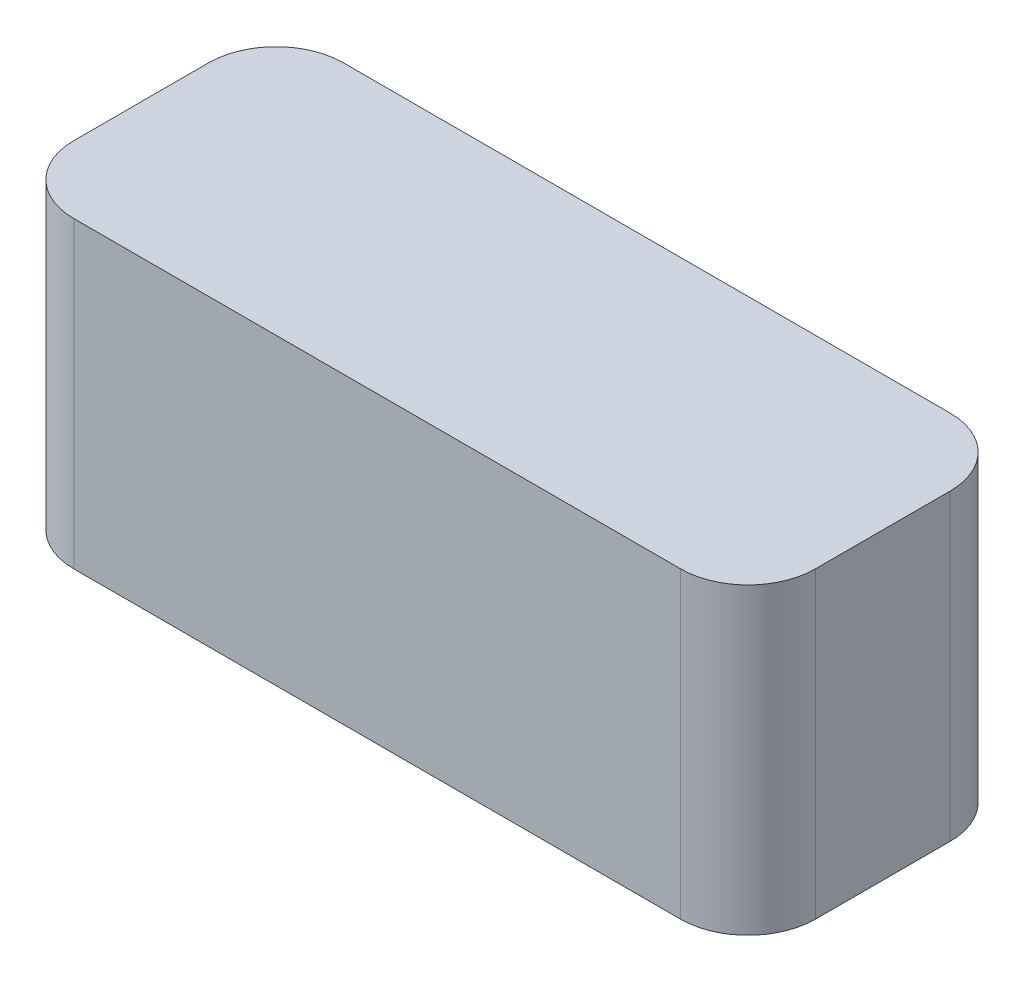
ISO-10303-21;
HEADER;
FILE_DESCRIPTION(('STEP AP214'),'2;1');
FILE_NAME('part.step','',(''),(''),'','','');
FILE_SCHEMA(('AUTOMOTIVE_DESIGN { 1 0 10303 214 1 1 1 1 }'));
ENDSEC;
DATA;
#1=APPLICATION_CONTEXT('core data for automotive mechanical design processes');
#2=APPLICATION_PROTOCOL_DEFINITION('international standard','automotive_design',2000,#1);
#3=PRODUCT_CONTEXT('',#1,'mechanical');
#4=PRODUCT('Part','Part','',(#3));
#5=PRODUCT_RELATED_PRODUCT_CATEGORY('part','',(#4));
#6=PRODUCT_DEFINITION_FORMATION('','',#4);
#7=PRODUCT_DEFINITION_CONTEXT('part definition',#1,'design');
#8=PRODUCT_DEFINITION('design','',#6,#7);
#9=PRODUCT_DEFINITION_SHAPE('','',#8);
#10=(LENGTH_UNIT() NAMED_UNIT(*) SI_UNIT(.MILLI.,.METRE.));
#11=(NAMED_UNIT(*) PLANE_ANGLE_UNIT() SI_UNIT($,.RADIAN.));
#12=(NAMED_UNIT(*) SI_UNIT($,.STERADIAN.) SOLID_ANGLE_UNIT());
#13=UNCERTAINTY_MEASURE_WITH_UNIT(LENGTH_MEASURE(1.E-05),#10,'distance_accuracy_value','');
#14=(GEOMETRIC_REPRESENTATION_CONTEXT(3) GLOBAL_UNCERTAINTY_ASSIGNED_CONTEXT((#13)) GLOBAL_UNIT_ASSIGNED_CONTEXT((#10,
#11,#12)) REPRESENTATION_CONTEXT('',''));
#15=CARTESIAN_POINT('',(0.,0.,0.));
#16=DIRECTION('',(0.,0.,1.));
#17=DIRECTION('',(1.,0.,0.));
#18=AXIS2_PLACEMENT_3D('',#15,#16,#17);
#19=CARTESIAN_POINT('',(0.,0.,40.));
#20=DIRECTION('',(1.,0.,0.));
#21=DIRECTION('',(0.,0.,-1.));
#22=AXIS2_PLACEMENT_3D('',#19,#20,#21);
#23=PLANE('',#22);
#24=DIRECTION('',(0.,0.,-1.));
#25=VECTOR('',#24,1.);
#26=CARTESIAN_POINT('',(0.,45.,40.));
#27=LINE('',#26,#25);
#28=CARTESIAN_POINT('',(0.,45.,30.));
#29=VERTEX_POINT('',#28);
#30=CARTESIAN_POINT('',(0.,45.,10.));
#31=VERTEX_POINT('',#30);
#32=EDGE_CURVE('E122',#29,#31,#27,.T.);
#33=ORIENTED_EDGE('',*,*,#32,.T.);
#34=DIRECTION('',(0.,-1.,0.));
#35=VECTOR('',#34,1.);
#36=CARTESIAN_POINT('',(0.,0.,10.));
#37=LINE('',#36,#35);
#38=CARTESIAN_POINT('',(0.,0.,10.));
#39=VERTEX_POINT('',#38);
#40=EDGE_CURVE('E157',#31,#39,#37,.T.);
#41=ORIENTED_EDGE('',*,*,#40,.T.);
#42=DIRECTION('',(0.,0.,-1.));
#43=VECTOR('',#42,1.);
#44=CARTESIAN_POINT('',(0.,0.,40.));
#45=LINE('',#44,#43);
#46=CARTESIAN_POINT('',(0.,0.,30.));
#47=VERTEX_POINT('',#46);
#48=EDGE_CURVE('E114',#47,#39,#45,.T.);
#49=ORIENTED_EDGE('',*,*,#48,.F.);
#50=DIRECTION('',(0.,-1.,0.));
#51=VECTOR('',#50,1.);
#52=CARTESIAN_POINT('',(0.,0.,30.));
#53=LINE('',#52,#51);
#54=EDGE_CURVE('E101',#47,#29,#53,.F.);
#55=ORIENTED_EDGE('',*,*,#54,.T.);
#56=EDGE_LOOP('',(#33,#41,#49,#55));
#57=FACE_BOUND('',#56,.T.);
#58=ADVANCED_FACE('F32',(#57),#23,.F.);
#59=CARTESIAN_POINT('',(0.,0.,40.));
#60=DIRECTION('',(0.,1.,0.));
#61=DIRECTION('',(0.,0.,1.));
#62=AXIS2_PLACEMENT_3D('',#59,#60,#61);
#63=PLANE('',#62);
#64=ORIENTED_EDGE('',*,*,#48,.T.);
#65=CARTESIAN_POINT('',(10.,0.,10.));
#66=DIRECTION('',(0.,1.,0.));
#67=DIRECTION('',(0.,0.,1.));
#68=AXIS2_PLACEMENT_3D('',#65,#66,#67);
#69=CIRCLE('',#68,10.);
#70=CARTESIAN_POINT('',(10.,0.,0.));
#71=VERTEX_POINT('',#70);
#72=EDGE_CURVE('E54',#39,#71,#69,.F.);
#73=ORIENTED_EDGE('',*,*,#72,.T.);
#74=DIRECTION('',(1.,0.,0.));
#75=VECTOR('',#74,1.);
#76=CARTESIAN_POINT('',(0.,0.,0.));
#77=LINE('',#76,#75);
#78=CARTESIAN_POINT('',(100.,0.,0.));
#79=VERTEX_POINT('',#78);
#80=EDGE_CURVE('E124',#71,#79,#77,.T.);
#81=ORIENTED_EDGE('',*,*,#80,.T.);
#82=CARTESIAN_POINT('',(100.,0.,10.));
#83=DIRECTION('',(0.,1.,0.));
#84=DIRECTION('',(0.,0.,1.));
#85=AXIS2_PLACEMENT_3D('',#82,#83,#84);
#86=CIRCLE('',#85,10.);
#87=CARTESIAN_POINT('',(110.,0.,10.));
#88=VERTEX_POINT('',#87);
#89=EDGE_CURVE('E155',#79,#88,#86,.F.);
#90=ORIENTED_EDGE('',*,*,#89,.T.);
#91=DIRECTION('',(0.,0.,-1.));
#92=VECTOR('',#91,1.);
#93=CARTESIAN_POINT('',(110.,0.,40.));
#94=LINE('',#93,#92);
#95=CARTESIAN_POINT('',(110.,0.,30.));
#96=VERTEX_POINT('',#95);
#97=EDGE_CURVE('E133',#96,#88,#94,.T.);
#98=ORIENTED_EDGE('',*,*,#97,.F.);
#99=CARTESIAN_POINT('',(100.,0.,30.));
#100=DIRECTION('',(0.,1.,0.));
#101=DIRECTION('',(0.,0.,1.));
#102=AXIS2_PLACEMENT_3D('',#99,#100,#101);
#103=CIRCLE('',#102,10.);
#104=CARTESIAN_POINT('',(100.,0.,40.));
#105=VERTEX_POINT('',#104);
#106=EDGE_CURVE('E119',#96,#105,#103,.F.);
#107=ORIENTED_EDGE('',*,*,#106,.T.);
#108=DIRECTION('',(1.,0.,0.));
#109=VECTOR('',#108,1.);
#110=CARTESIAN_POINT('',(0.,0.,40.));
#111=LINE('',#110,#109);
#112=CARTESIAN_POINT('',(10.,0.,40.));
#113=VERTEX_POINT('',#112);
#114=EDGE_CURVE('E109',#113,#105,#111,.T.);
#115=ORIENTED_EDGE('',*,*,#114,.F.);
#116=CARTESIAN_POINT('',(10.,0.,30.));
#117=DIRECTION('',(0.,1.,0.));
#118=DIRECTION('',(0.,0.,1.));
#119=AXIS2_PLACEMENT_3D('',#116,#117,#118);
#120=CIRCLE('',#119,10.);
#121=EDGE_CURVE('E96',#113,#47,#120,.F.);
#122=ORIENTED_EDGE('',*,*,#121,.T.);
#123=EDGE_LOOP('',(#64,#73,#81,#90,#98,#107,#115,#122));
#124=FACE_BOUND('',#123,.T.);
#125=ADVANCED_FACE('F116',(#124),#63,.F.);
#126=CARTESIAN_POINT('',(110.,0.,40.));
#127=DIRECTION('',(-1.,0.,0.));
#128=DIRECTION('',(0.,0.,1.));
#129=AXIS2_PLACEMENT_3D('',#126,#127,#128);
#130=PLANE('',#129);
#131=ORIENTED_EDGE('',*,*,#97,.T.);
#132=DIRECTION('',(0.,1.,0.));
#133=VECTOR('',#132,1.);
#134=CARTESIAN_POINT('',(110.,45.,10.));
#135=LINE('',#134,#133);
#136=CARTESIAN_POINT('',(110.,45.,10.));
#137=VERTEX_POINT('',#136);
#138=EDGE_CURVE('E147',#88,#137,#135,.T.);
#139=ORIENTED_EDGE('',*,*,#138,.T.);
#140=DIRECTION('',(0.,0.,-1.));
#141=VECTOR('',#140,1.);
#142=CARTESIAN_POINT('',(110.,45.,40.));
#143=LINE('',#142,#141);
#144=CARTESIAN_POINT('',(110.,45.,30.));
#145=VERTEX_POINT('',#144);
#146=EDGE_CURVE('E130',#145,#137,#143,.T.);
#147=ORIENTED_EDGE('',*,*,#146,.F.);
#148=DIRECTION('',(0.,1.,0.));
#149=VECTOR('',#148,1.);
#150=CARTESIAN_POINT('',(110.,0.,30.));
#151=LINE('',#150,#149);
#152=EDGE_CURVE('E144',#145,#96,#151,.F.);
#153=ORIENTED_EDGE('',*,*,#152,.T.);
#154=EDGE_LOOP('',(#131,#139,#147,#153));
#155=FACE_BOUND('',#154,.T.);
#156=ADVANCED_FACE('F174',(#155),#130,.F.);
#157=CARTESIAN_POINT('',(0.,45.,40.));
#158=DIRECTION('',(0.,-1.,0.));
#159=DIRECTION('',(0.,0.,-1.));
#160=AXIS2_PLACEMENT_3D('',#157,#158,#159);
#161=PLANE('',#160);
#162=DIRECTION('',(-1.,0.,0.));
#163=VECTOR('',#162,1.);
#164=CARTESIAN_POINT('',(0.,45.,0.));
#165=LINE('',#164,#163);
#166=CARTESIAN_POINT('',(100.,45.,0.));
#167=VERTEX_POINT('',#166);
#168=CARTESIAN_POINT('',(10.,45.,0.));
#169=VERTEX_POINT('',#168);
#170=EDGE_CURVE('E120',#167,#169,#165,.T.);
#171=ORIENTED_EDGE('',*,*,#170,.T.);
#172=CARTESIAN_POINT('',(10.,45.,10.));
#173=DIRECTION('',(0.,-1.,0.));
#174=DIRECTION('',(0.,0.,-1.));
#175=AXIS2_PLACEMENT_3D('',#172,#173,#174);
#176=CIRCLE('',#175,10.);
#177=EDGE_CURVE('E11',#169,#31,#176,.F.);
#178=ORIENTED_EDGE('',*,*,#177,.T.);
#179=ORIENTED_EDGE('',*,*,#32,.F.);
#180=CARTESIAN_POINT('',(10.,45.,30.));
#181=DIRECTION('',(0.,-1.,0.));
#182=DIRECTION('',(0.,0.,-1.));
#183=AXIS2_PLACEMENT_3D('',#180,#181,#182);
#184=CIRCLE('',#183,10.);
#185=CARTESIAN_POINT('',(10.,45.,40.));
#186=VERTEX_POINT('',#185);
#187=EDGE_CURVE('E138',#29,#186,#184,.F.);
#188=ORIENTED_EDGE('',*,*,#187,.T.);
#189=DIRECTION('',(-1.,0.,0.));
#190=VECTOR('',#189,1.);
#191=CARTESIAN_POINT('',(0.,45.,40.));
#192=LINE('',#191,#190);
#193=CARTESIAN_POINT('',(100.,45.,40.));
#194=VERTEX_POINT('',#193);
#195=EDGE_CURVE('E112',#194,#186,#192,.T.);
#196=ORIENTED_EDGE('',*,*,#195,.F.);
#197=CARTESIAN_POINT('',(100.,45.,30.));
#198=DIRECTION('',(0.,-1.,0.));
#199=DIRECTION('',(0.,0.,-1.));
#200=AXIS2_PLACEMENT_3D('',#197,#198,#199);
#201=CIRCLE('',#200,10.);
#202=EDGE_CURVE('E142',#194,#145,#201,.F.);
#203=ORIENTED_EDGE('',*,*,#202,.T.);
#204=ORIENTED_EDGE('',*,*,#146,.T.);
#205=CARTESIAN_POINT('',(100.,45.,10.));
#206=DIRECTION('',(0.,-1.,0.));
#207=DIRECTION('',(0.,0.,-1.));
#208=AXIS2_PLACEMENT_3D('',#205,#206,#207);
#209=CIRCLE('',#208,10.);
#210=EDGE_CURVE('E150',#137,#167,#209,.F.);
#211=ORIENTED_EDGE('',*,*,#210,.T.);
#212=EDGE_LOOP('',(#171,#178,#179,#188,#196,#203,#204,#211));
#213=FACE_BOUND('',#212,.T.);
#214=ADVANCED_FACE('F166',(#213),#161,.F.);
#215=CARTESIAN_POINT('',(0.,0.,40.));
#216=DIRECTION('',(0.,0.,-1.));
#217=DIRECTION('',(-1.,0.,0.));
#218=AXIS2_PLACEMENT_3D('',#215,#216,#217);
#219=PLANE('',#218);
#220=ORIENTED_EDGE('',*,*,#114,.T.);
#221=DIRECTION('',(0.,1.,0.));
#222=VECTOR('',#221,1.);
#223=CARTESIAN_POINT('',(100.,0.,40.));
#224=LINE('',#223,#222);
#225=EDGE_CURVE('E140',#105,#194,#224,.T.);
#226=ORIENTED_EDGE('',*,*,#225,.T.);
#227=ORIENTED_EDGE('',*,*,#195,.T.);
#228=DIRECTION('',(0.,-1.,0.));
#229=VECTOR('',#228,1.);
#230=CARTESIAN_POINT('',(10.,0.,40.));
#231=LINE('',#230,#229);
#232=EDGE_CURVE('E100',#186,#113,#231,.T.);
#233=ORIENTED_EDGE('',*,*,#232,.T.);
#234=EDGE_LOOP('',(#220,#226,#227,#233));
#235=FACE_BOUND('',#234,.T.);
#236=ADVANCED_FACE('F107',(#235),#219,.F.);
#237=CARTESIAN_POINT('',(0.,0.,0.));
#238=DIRECTION('',(0.,0.,-1.));
#239=DIRECTION('',(-1.,0.,0.));
#240=AXIS2_PLACEMENT_3D('',#237,#238,#239);
#241=PLANE('',#240);
#242=ORIENTED_EDGE('',*,*,#80,.F.);
#243=DIRECTION('',(0.,-1.,0.));
#244=VECTOR('',#243,1.);
#245=CARTESIAN_POINT('',(10.,45.,0.));
#246=LINE('',#245,#244);
#247=EDGE_CURVE('E40',#71,#169,#246,.F.);
#248=ORIENTED_EDGE('',*,*,#247,.T.);
#249=ORIENTED_EDGE('',*,*,#170,.F.);
#250=DIRECTION('',(0.,1.,0.));
#251=VECTOR('',#250,1.);
#252=CARTESIAN_POINT('',(100.,0.,0.));
#253=LINE('',#252,#251);
#254=EDGE_CURVE('E152',#167,#79,#253,.F.);
#255=ORIENTED_EDGE('',*,*,#254,.T.);
#256=EDGE_LOOP('',(#242,#248,#249,#255));
#257=FACE_BOUND('',#256,.T.);
#258=ADVANCED_FACE('F168',(#257),#241,.T.);
#259=CARTESIAN_POINT('',(10.,0.,30.));
#260=DIRECTION('',(0.,-1.,0.));
#261=DIRECTION('',(0.,0.,-1.));
#262=AXIS2_PLACEMENT_3D('',#259,#260,#261);
#263=CYLINDRICAL_SURFACE('',#262,10.);
#264=ORIENTED_EDGE('',*,*,#187,.F.);
#265=ORIENTED_EDGE('',*,*,#54,.F.);
#266=ORIENTED_EDGE('',*,*,#121,.F.);
#267=ORIENTED_EDGE('',*,*,#232,.F.);
#268=EDGE_LOOP('',(#264,#265,#266,#267));
#269=FACE_BOUND('',#268,.T.);
#270=ADVANCED_FACE('F99',(#269),#263,.T.);
#271=CARTESIAN_POINT('',(100.,0.,30.));
#272=DIRECTION('',(0.,1.,0.));
#273=DIRECTION('',(0.,0.,1.));
#274=AXIS2_PLACEMENT_3D('',#271,#272,#273);
#275=CYLINDRICAL_SURFACE('',#274,10.);
#276=ORIENTED_EDGE('',*,*,#106,.F.);
#277=ORIENTED_EDGE('',*,*,#152,.F.);
#278=ORIENTED_EDGE('',*,*,#202,.F.);
#279=ORIENTED_EDGE('',*,*,#225,.F.);
#280=EDGE_LOOP('',(#276,#277,#278,#279));
#281=FACE_BOUND('',#280,.T.);
#282=ADVANCED_FACE('F178',(#281),#275,.T.);
#283=CARTESIAN_POINT('',(100.,0.,10.));
#284=DIRECTION('',(0.,-1.,0.));
#285=DIRECTION('',(0.,0.,-1.));
#286=AXIS2_PLACEMENT_3D('',#283,#284,#285);
#287=CYLINDRICAL_SURFACE('',#286,10.);
#288=ORIENTED_EDGE('',*,*,#89,.F.);
#289=ORIENTED_EDGE('',*,*,#254,.F.);
#290=ORIENTED_EDGE('',*,*,#210,.F.);
#291=ORIENTED_EDGE('',*,*,#138,.F.);
#292=EDGE_LOOP('',(#288,#289,#290,#291));
#293=FACE_BOUND('',#292,.T.);
#294=ADVANCED_FACE('F171',(#293),#287,.T.);
#295=CARTESIAN_POINT('',(10.,0.,10.));
#296=DIRECTION('',(0.,1.,0.));
#297=DIRECTION('',(0.,0.,1.));
#298=AXIS2_PLACEMENT_3D('',#295,#296,#297);
#299=CYLINDRICAL_SURFACE('',#298,10.);
#300=ORIENTED_EDGE('',*,*,#177,.F.);
#301=ORIENTED_EDGE('',*,*,#247,.F.);
#302=ORIENTED_EDGE('',*,*,#72,.F.);
#303=ORIENTED_EDGE('',*,*,#40,.F.);
#304=EDGE_LOOP('',(#300,#301,#302,#303));
#305=FACE_BOUND('',#304,.T.);
#306=ADVANCED_FACE('F34',(#305),#299,.T.);
#307=CLOSED_SHELL('',(#58,#125,#156,#214,#236,#258,#270,#282,#294,#306));
#308=MANIFOLD_SOLID_BREP('B2',#307);
#309=ADVANCED_BREP_SHAPE_REPRESENTATION('',(#18,#308),#14);
#310=SHAPE_DEFINITION_REPRESENTATION(#9,#309);
ENDSEC;
END-ISO-10303-21;
